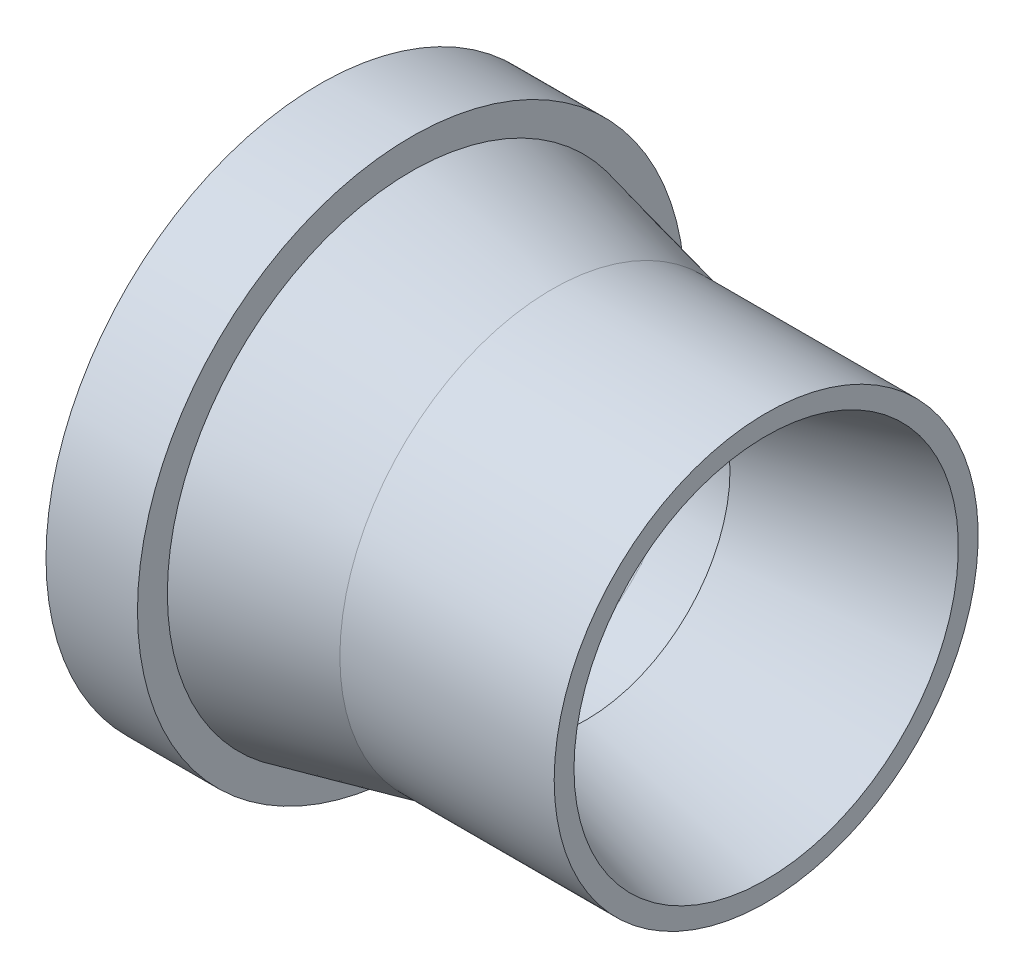
ISO-10303-21;
HEADER;
FILE_DESCRIPTION(('STEP AP214'),'2;1');
FILE_NAME('part.step','',(''),(''),'','','');
FILE_SCHEMA(('AUTOMOTIVE_DESIGN { 1 0 10303 214 1 1 1 1 }'));
ENDSEC;
DATA;
#1=APPLICATION_CONTEXT('core data for automotive mechanical design processes');
#2=APPLICATION_PROTOCOL_DEFINITION('international standard','automotive_design',2000,#1);
#3=PRODUCT_CONTEXT('',#1,'mechanical');
#4=PRODUCT('Part','Part','',(#3));
#5=PRODUCT_RELATED_PRODUCT_CATEGORY('part','',(#4));
#6=PRODUCT_DEFINITION_FORMATION('','',#4);
#7=PRODUCT_DEFINITION_CONTEXT('part definition',#1,'design');
#8=PRODUCT_DEFINITION('design','',#6,#7);
#9=PRODUCT_DEFINITION_SHAPE('','',#8);
#10=(LENGTH_UNIT() NAMED_UNIT(*) SI_UNIT(.MILLI.,.METRE.));
#11=(NAMED_UNIT(*) PLANE_ANGLE_UNIT() SI_UNIT($,.RADIAN.));
#12=(NAMED_UNIT(*) SI_UNIT($,.STERADIAN.) SOLID_ANGLE_UNIT());
#13=UNCERTAINTY_MEASURE_WITH_UNIT(LENGTH_MEASURE(1.E-05),#10,'distance_accuracy_value','');
#14=(GEOMETRIC_REPRESENTATION_CONTEXT(3) GLOBAL_UNCERTAINTY_ASSIGNED_CONTEXT((#13)) GLOBAL_UNIT_ASSIGNED_CONTEXT((#10,
#11,#12)) REPRESENTATION_CONTEXT('',''));
#15=CARTESIAN_POINT('',(0.,0.,0.));
#16=DIRECTION('',(0.,0.,1.));
#17=DIRECTION('',(1.,0.,0.));
#18=AXIS2_PLACEMENT_3D('',#15,#16,#17);
#19=CARTESIAN_POINT('',(0.,0.,0.));
#20=DIRECTION('',(-1.,0.,0.));
#21=DIRECTION('',(0.,0.,1.));
#22=AXIS2_PLACEMENT_3D('',#19,#20,#21);
#23=CYLINDRICAL_SURFACE('',#22,34.798);
#24=CARTESIAN_POINT('',(0.,0.,0.));
#25=DIRECTION('',(-1.,0.,0.));
#26=DIRECTION('',(0.,0.,1.));
#27=AXIS2_PLACEMENT_3D('',#24,#25,#26);
#28=CIRCLE('',#27,34.798);
#29=CARTESIAN_POINT('',(0.,0.,34.798));
#30=VERTEX_POINT('',#29);
#31=EDGE_CURVE('E90',#30,#30,#28,.T.);
#32=ORIENTED_EDGE('',*,*,#31,.F.);
#33=EDGE_LOOP('',(#32));
#34=FACE_BOUND('',#33,.T.);
#35=CARTESIAN_POINT('',(11.6269295069273,0.,0.));
#36=DIRECTION('',(-1.,0.,0.));
#37=DIRECTION('',(0.,0.,1.));
#38=AXIS2_PLACEMENT_3D('',#35,#36,#37);
#39=CIRCLE('',#38,34.798);
#40=CARTESIAN_POINT('',(11.6269295069273,0.,34.798));
#41=VERTEX_POINT('',#40);
#42=EDGE_CURVE('E10',#41,#41,#39,.T.);
#43=ORIENTED_EDGE('',*,*,#42,.T.);
#44=EDGE_LOOP('',(#43));
#45=FACE_BOUND('',#44,.T.);
#46=ADVANCED_FACE('F43',(#34,#45),#23,.T.);
#47=CARTESIAN_POINT('',(11.6269295069273,34.798,0.));
#48=DIRECTION('',(-1.,0.,0.));
#49=DIRECTION('',(0.,0.,1.));
#50=AXIS2_PLACEMENT_3D('',#47,#48,#49);
#51=PLANE('',#50);
#52=ORIENTED_EDGE('',*,*,#42,.F.);
#53=EDGE_LOOP('',(#52));
#54=FACE_BOUND('',#53,.T.);
#55=CARTESIAN_POINT('',(11.6269295069273,0.,0.));
#56=DIRECTION('',(-1.,0.,0.));
#57=DIRECTION('',(0.,0.,1.));
#58=AXIS2_PLACEMENT_3D('',#55,#56,#57);
#59=CIRCLE('',#58,31.0014709454852);
#60=CARTESIAN_POINT('',(11.6269295069273,0.,31.0014709454852));
#61=VERTEX_POINT('',#60);
#62=EDGE_CURVE('E50',#61,#61,#59,.T.);
#63=ORIENTED_EDGE('',*,*,#62,.T.);
#64=EDGE_LOOP('',(#63));
#65=FACE_BOUND('',#64,.T.);
#66=ADVANCED_FACE('F98',(#54,#65),#51,.F.);
#67=CARTESIAN_POINT('',(29.4966103274177,0.,0.));
#68=DIRECTION('',(-1.,0.,0.));
#69=DIRECTION('',(0.,0.,1.));
#70=AXIS2_PLACEMENT_3D('',#67,#68,#69);
#71=CONICAL_SURFACE('',#70,26.9445704348874,0.223242956285071);
#72=ORIENTED_EDGE('',*,*,#62,.F.);
#73=EDGE_LOOP('',(#72));
#74=FACE_BOUND('',#73,.T.);
#75=CARTESIAN_POINT('',(29.4966103274177,0.,0.));
#76=DIRECTION('',(-1.,0.,0.));
#77=DIRECTION('',(0.,0.,1.));
#78=AXIS2_PLACEMENT_3D('',#75,#76,#77);
#79=CIRCLE('',#78,26.9445704348874);
#80=CARTESIAN_POINT('',(29.4966103274177,0.,26.9445704348874));
#81=VERTEX_POINT('',#80);
#82=EDGE_CURVE('E55',#81,#81,#79,.T.);
#83=ORIENTED_EDGE('',*,*,#82,.T.);
#84=EDGE_LOOP('',(#83));
#85=FACE_BOUND('',#84,.T.);
#86=ADVANCED_FACE('F102',(#74,#85),#71,.T.);
#87=CARTESIAN_POINT('',(0.,0.,0.));
#88=DIRECTION('',(-1.,0.,0.));
#89=DIRECTION('',(0.,0.,1.));
#90=AXIS2_PLACEMENT_3D('',#87,#88,#89);
#91=CYLINDRICAL_SURFACE('',#90,26.9445704348874);
#92=ORIENTED_EDGE('',*,*,#82,.F.);
#93=EDGE_LOOP('',(#92));
#94=FACE_BOUND('',#93,.T.);
#95=CARTESIAN_POINT('',(56.7357994700031,0.,0.));
#96=DIRECTION('',(-1.,0.,0.));
#97=DIRECTION('',(0.,0.,1.));
#98=AXIS2_PLACEMENT_3D('',#95,#96,#97);
#99=CIRCLE('',#98,26.9445704348874);
#100=CARTESIAN_POINT('',(56.7357994700031,0.,26.9445704348874));
#101=VERTEX_POINT('',#100);
#102=EDGE_CURVE('E60',#101,#101,#99,.T.);
#103=ORIENTED_EDGE('',*,*,#102,.T.);
#104=EDGE_LOOP('',(#103));
#105=FACE_BOUND('',#104,.T.);
#106=ADVANCED_FACE('F107',(#94,#105),#91,.T.);
#107=CARTESIAN_POINT('',(56.7357994700031,26.9445704348874,0.));
#108=DIRECTION('',(-1.,0.,0.));
#109=DIRECTION('',(0.,0.,1.));
#110=AXIS2_PLACEMENT_3D('',#107,#108,#109);
#111=PLANE('',#110);
#112=ORIENTED_EDGE('',*,*,#102,.F.);
#113=EDGE_LOOP('',(#112));
#114=FACE_BOUND('',#113,.T.);
#115=CARTESIAN_POINT('',(56.7357994700031,0.,0.));
#116=DIRECTION('',(-1.,0.,0.));
#117=DIRECTION('',(0.,0.,1.));
#118=AXIS2_PLACEMENT_3D('',#115,#116,#117);
#119=CIRCLE('',#118,24.42663247495);
#120=CARTESIAN_POINT('',(56.7357994700031,0.,24.42663247495));
#121=VERTEX_POINT('',#120);
#122=EDGE_CURVE('E66',#121,#121,#119,.T.);
#123=ORIENTED_EDGE('',*,*,#122,.T.);
#124=EDGE_LOOP('',(#123));
#125=FACE_BOUND('',#124,.T.);
#126=ADVANCED_FACE('F113',(#114,#125),#111,.F.);
#127=CARTESIAN_POINT('',(33.8432894459154,0.,0.));
#128=DIRECTION('',(1.,0.,0.));
#129=DIRECTION('',(0.,0.,-1.));
#130=AXIS2_PLACEMENT_3D('',#127,#128,#129);
#131=CONICAL_SURFACE('',#130,18.2926029012743,0.26179938779915);
#132=ORIENTED_EDGE('',*,*,#122,.F.);
#133=EDGE_LOOP('',(#132));
#134=FACE_BOUND('',#133,.T.);
#135=CARTESIAN_POINT('',(33.8432894459154,0.,0.));
#136=DIRECTION('',(-1.,0.,0.));
#137=DIRECTION('',(0.,0.,1.));
#138=AXIS2_PLACEMENT_3D('',#135,#136,#137);
#139=CIRCLE('',#138,18.2926029012743);
#140=CARTESIAN_POINT('',(33.8432894459154,0.,18.2926029012743));
#141=VERTEX_POINT('',#140);
#142=EDGE_CURVE('E70',#141,#141,#139,.T.);
#143=ORIENTED_EDGE('',*,*,#142,.T.);
#144=EDGE_LOOP('',(#143));
#145=FACE_BOUND('',#144,.T.);
#146=ADVANCED_FACE('F117',(#134,#145),#131,.F.);
#147=CARTESIAN_POINT('',(33.8432894459154,20.5350007100562,0.));
#148=DIRECTION('',(1.,0.,0.));
#149=DIRECTION('',(0.,0.,-1.));
#150=AXIS2_PLACEMENT_3D('',#147,#148,#149);
#151=PLANE('',#150);
#152=ORIENTED_EDGE('',*,*,#142,.F.);
#153=EDGE_LOOP('',(#152));
#154=FACE_BOUND('',#153,.T.);
#155=CARTESIAN_POINT('',(33.8432894459154,0.,0.));
#156=DIRECTION('',(-1.,0.,0.));
#157=DIRECTION('',(0.,0.,1.));
#158=AXIS2_PLACEMENT_3D('',#155,#156,#157);
#159=CIRCLE('',#158,20.5350007100562);
#160=CARTESIAN_POINT('',(33.8432894459154,0.,20.5350007100562));
#161=VERTEX_POINT('',#160);
#162=EDGE_CURVE('E74',#161,#161,#159,.T.);
#163=ORIENTED_EDGE('',*,*,#162,.T.);
#164=EDGE_LOOP('',(#163));
#165=FACE_BOUND('',#164,.T.);
#166=ADVANCED_FACE('F121',(#154,#165),#151,.F.);
#167=CARTESIAN_POINT('',(0.,0.,0.));
#168=DIRECTION('',(-1.,0.,0.));
#169=DIRECTION('',(0.,0.,1.));
#170=AXIS2_PLACEMENT_3D('',#167,#168,#169);
#171=CYLINDRICAL_SURFACE('',#170,20.5350007100562);
#172=ORIENTED_EDGE('',*,*,#162,.F.);
#173=EDGE_LOOP('',(#172));
#174=FACE_BOUND('',#173,.T.);
#175=CARTESIAN_POINT('',(25.1843715599546,0.,0.));
#176=DIRECTION('',(-1.,0.,0.));
#177=DIRECTION('',(0.,0.,1.));
#178=AXIS2_PLACEMENT_3D('',#175,#176,#177);
#179=CIRCLE('',#178,20.5350007100562);
#180=CARTESIAN_POINT('',(25.1843715599546,0.,20.5350007100562));
#181=VERTEX_POINT('',#180);
#182=EDGE_CURVE('E78',#181,#181,#179,.T.);
#183=ORIENTED_EDGE('',*,*,#182,.T.);
#184=EDGE_LOOP('',(#183));
#185=FACE_BOUND('',#184,.T.);
#186=ADVANCED_FACE('F125',(#174,#185),#171,.F.);
#187=CARTESIAN_POINT('',(16.7463515798246,0.,0.));
#188=DIRECTION('',(-1.,0.,0.));
#189=DIRECTION('',(0.,0.,1.));
#190=AXIS2_PLACEMENT_3D('',#187,#188,#189);
#191=CONICAL_SURFACE('',#190,22.7395916007812,0.255556099511531);
#192=ORIENTED_EDGE('',*,*,#182,.F.);
#193=EDGE_LOOP('',(#192));
#194=FACE_BOUND('',#193,.T.);
#195=CARTESIAN_POINT('',(16.7463515798246,0.,0.));
#196=DIRECTION('',(-1.,0.,0.));
#197=DIRECTION('',(0.,0.,1.));
#198=AXIS2_PLACEMENT_3D('',#195,#196,#197);
#199=CIRCLE('',#198,22.7395916007812);
#200=CARTESIAN_POINT('',(16.7463515798246,0.,22.7395916007812));
#201=VERTEX_POINT('',#200);
#202=EDGE_CURVE('E82',#201,#201,#199,.T.);
#203=ORIENTED_EDGE('',*,*,#202,.T.);
#204=EDGE_LOOP('',(#203));
#205=FACE_BOUND('',#204,.T.);
#206=ADVANCED_FACE('F129',(#194,#205),#191,.F.);
#207=CARTESIAN_POINT('',(0.,0.,0.));
#208=DIRECTION('',(-1.,0.,0.));
#209=DIRECTION('',(0.,0.,1.));
#210=AXIS2_PLACEMENT_3D('',#207,#208,#209);
#211=CYLINDRICAL_SURFACE('',#210,22.7395916007812);
#212=ORIENTED_EDGE('',*,*,#202,.F.);
#213=EDGE_LOOP('',(#212));
#214=FACE_BOUND('',#213,.T.);
#215=CARTESIAN_POINT('',(12.0584083992187,0.,0.));
#216=DIRECTION('',(-1.,0.,0.));
#217=DIRECTION('',(0.,0.,1.));
#218=AXIS2_PLACEMENT_3D('',#215,#216,#217);
#219=CIRCLE('',#218,22.7395916007812);
#220=CARTESIAN_POINT('',(12.0584083992187,0.,22.7395916007812));
#221=VERTEX_POINT('',#220);
#222=EDGE_CURVE('E86',#221,#221,#219,.T.);
#223=ORIENTED_EDGE('',*,*,#222,.T.);
#224=EDGE_LOOP('',(#223));
#225=FACE_BOUND('',#224,.T.);
#226=ADVANCED_FACE('F133',(#214,#225),#211,.F.);
#227=CARTESIAN_POINT('',(0.,0.,0.));
#228=DIRECTION('',(-1.,0.,0.));
#229=DIRECTION('',(0.,0.,1.));
#230=AXIS2_PLACEMENT_3D('',#227,#228,#229);
#231=CONICAL_SURFACE('',#230,34.798,0.78539816339745);
#232=ORIENTED_EDGE('',*,*,#222,.F.);
#233=EDGE_LOOP('',(#232));
#234=FACE_BOUND('',#233,.T.);
#235=ORIENTED_EDGE('',*,*,#31,.T.);
#236=EDGE_LOOP('',(#235));
#237=FACE_BOUND('',#236,.T.);
#238=ADVANCED_FACE('F95',(#234,#237),#231,.F.);
#239=CLOSED_SHELL('',(#46,#66,#86,#106,#126,#146,#166,#186,#206,#226,#238));
#240=MANIFOLD_SOLID_BREP('B2',#239);
#241=ADVANCED_BREP_SHAPE_REPRESENTATION('',(#18,#240),#14);
#242=SHAPE_DEFINITION_REPRESENTATION(#9,#241);
ENDSEC;
END-ISO-10303-21;
